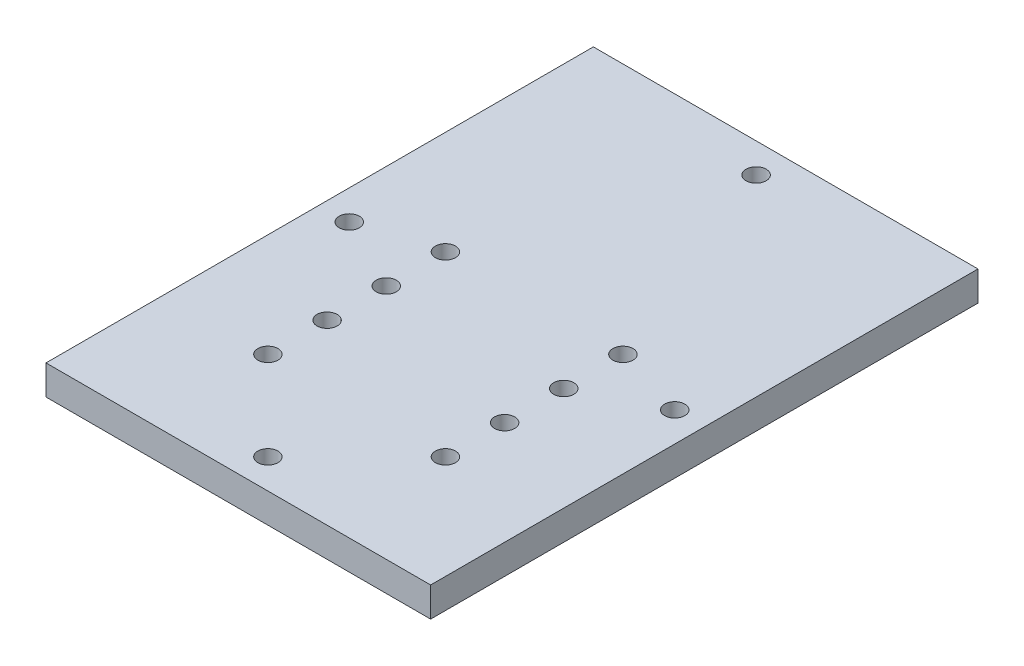
ISO-10303-21;
HEADER;
FILE_DESCRIPTION(('STEP AP214'),'2;1');
FILE_NAME('part.step','',(''),(''),'','','');
FILE_SCHEMA(('AUTOMOTIVE_DESIGN { 1 0 10303 214 1 1 1 1 }'));
ENDSEC;
DATA;
#1=APPLICATION_CONTEXT('core data for automotive mechanical design processes');
#2=APPLICATION_PROTOCOL_DEFINITION('international standard','automotive_design',2000,#1);
#3=PRODUCT_CONTEXT('',#1,'mechanical');
#4=PRODUCT('Part','Part','',(#3));
#5=PRODUCT_RELATED_PRODUCT_CATEGORY('part','',(#4));
#6=PRODUCT_DEFINITION_FORMATION('','',#4);
#7=PRODUCT_DEFINITION_CONTEXT('part definition',#1,'design');
#8=PRODUCT_DEFINITION('design','',#6,#7);
#9=PRODUCT_DEFINITION_SHAPE('','',#8);
#10=(LENGTH_UNIT() NAMED_UNIT(*) SI_UNIT(.MILLI.,.METRE.));
#11=(NAMED_UNIT(*) PLANE_ANGLE_UNIT() SI_UNIT($,.RADIAN.));
#12=(NAMED_UNIT(*) SI_UNIT($,.STERADIAN.) SOLID_ANGLE_UNIT());
#13=UNCERTAINTY_MEASURE_WITH_UNIT(LENGTH_MEASURE(1.E-05),#10,'distance_accuracy_value','');
#14=(GEOMETRIC_REPRESENTATION_CONTEXT(3) GLOBAL_UNCERTAINTY_ASSIGNED_CONTEXT((#13)) GLOBAL_UNIT_ASSIGNED_CONTEXT((#10,
#11,#12)) REPRESENTATION_CONTEXT('',''));
#15=CARTESIAN_POINT('',(0.,0.,0.));
#16=DIRECTION('',(0.,0.,1.));
#17=DIRECTION('',(1.,0.,0.));
#18=AXIS2_PLACEMENT_3D('',#15,#16,#17);
#19=CARTESIAN_POINT('',(0.,25.4,0.));
#20=DIRECTION('',(0.,1.,0.));
#21=DIRECTION('',(0.,0.,1.));
#22=AXIS2_PLACEMENT_3D('',#19,#20,#21);
#23=PLANE('',#22);
#24=CARTESIAN_POINT('',(-241.3,25.4,-203.2));
#25=DIRECTION('',(0.,1.,0.));
#26=DIRECTION('',(0.,0.,1.));
#27=AXIS2_PLACEMENT_3D('',#24,#25,#26);
#28=CIRCLE('',#27,8.64870000000001);
#29=CARTESIAN_POINT('',(-241.3,25.4,-194.5513));
#30=VERTEX_POINT('',#29);
#31=EDGE_CURVE('E174',#30,#30,#28,.T.);
#32=ORIENTED_EDGE('',*,*,#31,.F.);
#33=EDGE_LOOP('',(#32));
#34=FACE_BOUND('',#33,.T.);
#35=CARTESIAN_POINT('',(-241.3,25.4,-101.6));
#36=DIRECTION('',(0.,1.,0.));
#37=DIRECTION('',(0.,0.,1.));
#38=AXIS2_PLACEMENT_3D('',#35,#36,#37);
#39=CIRCLE('',#38,8.64870000000001);
#40=CARTESIAN_POINT('',(-241.3,25.4,-92.9513));
#41=VERTEX_POINT('',#40);
#42=EDGE_CURVE('E162',#41,#41,#39,.T.);
#43=ORIENTED_EDGE('',*,*,#42,.F.);
#44=EDGE_LOOP('',(#43));
#45=FACE_BOUND('',#44,.T.);
#46=CARTESIAN_POINT('',(-88.9,25.4,-203.2));
#47=DIRECTION('',(0.,1.,0.));
#48=DIRECTION('',(0.,0.,1.));
#49=AXIS2_PLACEMENT_3D('',#46,#47,#48);
#50=CIRCLE('',#49,8.64869999999993);
#51=CARTESIAN_POINT('',(-88.9,25.4,-194.5513));
#52=VERTEX_POINT('',#51);
#53=EDGE_CURVE('E150',#52,#52,#50,.T.);
#54=ORIENTED_EDGE('',*,*,#53,.F.);
#55=EDGE_LOOP('',(#54));
#56=FACE_BOUND('',#55,.T.);
#57=CARTESIAN_POINT('',(-88.9,25.4,-101.6));
#58=DIRECTION('',(0.,1.,0.));
#59=DIRECTION('',(0.,0.,1.));
#60=AXIS2_PLACEMENT_3D('',#57,#58,#59);
#61=CIRCLE('',#60,8.64869999999999);
#62=CARTESIAN_POINT('',(-88.9,25.4,-92.9513));
#63=VERTEX_POINT('',#62);
#64=EDGE_CURVE('E138',#63,#63,#61,.T.);
#65=ORIENTED_EDGE('',*,*,#64,.F.);
#66=EDGE_LOOP('',(#65));
#67=FACE_BOUND('',#66,.T.);
#68=CARTESIAN_POINT('',(-165.1,25.4,-25.4));
#69=DIRECTION('',(0.,1.,0.));
#70=DIRECTION('',(0.,0.,1.));
#71=AXIS2_PLACEMENT_3D('',#68,#69,#70);
#72=CIRCLE('',#71,8.64870000000001);
#73=CARTESIAN_POINT('',(-165.1,25.4,-16.7513));
#74=VERTEX_POINT('',#73);
#75=EDGE_CURVE('E126',#74,#74,#72,.T.);
#76=ORIENTED_EDGE('',*,*,#75,.F.);
#77=EDGE_LOOP('',(#76));
#78=FACE_BOUND('',#77,.T.);
#79=CARTESIAN_POINT('',(-165.1,25.4,-444.5));
#80=DIRECTION('',(0.,1.,0.));
#81=DIRECTION('',(0.,0.,1.));
#82=AXIS2_PLACEMENT_3D('',#79,#80,#81);
#83=CIRCLE('',#82,8.6487);
#84=CARTESIAN_POINT('',(-165.1,25.4,-435.8513));
#85=VERTEX_POINT('',#84);
#86=EDGE_CURVE('E105',#85,#85,#83,.T.);
#87=ORIENTED_EDGE('',*,*,#86,.F.);
#88=EDGE_LOOP('',(#87));
#89=FACE_BOUND('',#88,.T.);
#90=DIRECTION('',(0.,0.,-1.));
#91=VECTOR('',#90,1.);
#92=CARTESIAN_POINT('',(0.,25.4,0.));
#93=LINE('',#92,#91);
#94=CARTESIAN_POINT('',(0.,25.4,0.));
#95=VERTEX_POINT('',#94);
#96=CARTESIAN_POINT('',(0.,25.4,-469.9));
#97=VERTEX_POINT('',#96);
#98=EDGE_CURVE('E90',#95,#97,#93,.T.);
#99=ORIENTED_EDGE('',*,*,#98,.T.);
#100=DIRECTION('',(-1.,0.,0.));
#101=VECTOR('',#100,1.);
#102=CARTESIAN_POINT('',(0.,25.4,-469.9));
#103=LINE('',#102,#101);
#104=CARTESIAN_POINT('',(-330.2,25.4,-469.9));
#105=VERTEX_POINT('',#104);
#106=EDGE_CURVE('E85',#97,#105,#103,.T.);
#107=ORIENTED_EDGE('',*,*,#106,.T.);
#108=DIRECTION('',(0.,0.,1.));
#109=VECTOR('',#108,1.);
#110=CARTESIAN_POINT('',(-330.2,25.4,0.));
#111=LINE('',#110,#109);
#112=CARTESIAN_POINT('',(-330.2,25.4,0.));
#113=VERTEX_POINT('',#112);
#114=EDGE_CURVE('E88',#105,#113,#111,.T.);
#115=ORIENTED_EDGE('',*,*,#114,.T.);
#116=DIRECTION('',(1.,0.,0.));
#117=VECTOR('',#116,1.);
#118=CARTESIAN_POINT('',(0.,25.4,0.));
#119=LINE('',#118,#117);
#120=EDGE_CURVE('E55',#113,#95,#119,.T.);
#121=ORIENTED_EDGE('',*,*,#120,.T.);
#122=EDGE_LOOP('',(#99,#107,#115,#121));
#123=FACE_BOUND('',#122,.T.);
#124=CARTESIAN_POINT('',(-25.4,25.4,-234.95));
#125=DIRECTION('',(0.,1.,0.));
#126=DIRECTION('',(0.,0.,1.));
#127=AXIS2_PLACEMENT_3D('',#124,#125,#126);
#128=CIRCLE('',#127,8.6487);
#129=CARTESIAN_POINT('',(-25.4,25.4,-226.3013));
#130=VERTEX_POINT('',#129);
#131=EDGE_CURVE('E120',#130,#130,#128,.T.);
#132=ORIENTED_EDGE('',*,*,#131,.F.);
#133=EDGE_LOOP('',(#132));
#134=FACE_BOUND('',#133,.T.);
#135=CARTESIAN_POINT('',(-304.8,25.4,-234.95));
#136=DIRECTION('',(0.,1.,0.));
#137=DIRECTION('',(0.,0.,1.));
#138=AXIS2_PLACEMENT_3D('',#135,#136,#137);
#139=CIRCLE('',#138,8.64870000000001);
#140=CARTESIAN_POINT('',(-304.8,25.4,-226.3013));
#141=VERTEX_POINT('',#140);
#142=EDGE_CURVE('E132',#141,#141,#139,.T.);
#143=ORIENTED_EDGE('',*,*,#142,.F.);
#144=EDGE_LOOP('',(#143));
#145=FACE_BOUND('',#144,.T.);
#146=CARTESIAN_POINT('',(-88.9,25.4,-152.4));
#147=DIRECTION('',(0.,1.,0.));
#148=DIRECTION('',(0.,0.,1.));
#149=AXIS2_PLACEMENT_3D('',#146,#147,#148);
#150=CIRCLE('',#149,8.64869999999999);
#151=CARTESIAN_POINT('',(-88.9,25.4,-143.7513));
#152=VERTEX_POINT('',#151);
#153=EDGE_CURVE('E144',#152,#152,#150,.T.);
#154=ORIENTED_EDGE('',*,*,#153,.F.);
#155=EDGE_LOOP('',(#154));
#156=FACE_BOUND('',#155,.T.);
#157=CARTESIAN_POINT('',(-88.9,25.4,-254.));
#158=DIRECTION('',(0.,1.,0.));
#159=DIRECTION('',(0.,0.,1.));
#160=AXIS2_PLACEMENT_3D('',#157,#158,#159);
#161=CIRCLE('',#160,8.64869999999982);
#162=CARTESIAN_POINT('',(-88.9,25.4,-245.3513));
#163=VERTEX_POINT('',#162);
#164=EDGE_CURVE('E156',#163,#163,#161,.T.);
#165=ORIENTED_EDGE('',*,*,#164,.F.);
#166=EDGE_LOOP('',(#165));
#167=FACE_BOUND('',#166,.T.);
#168=CARTESIAN_POINT('',(-241.3,25.4,-152.4));
#169=DIRECTION('',(0.,1.,0.));
#170=DIRECTION('',(0.,0.,1.));
#171=AXIS2_PLACEMENT_3D('',#168,#169,#170);
#172=CIRCLE('',#171,8.64870000000001);
#173=CARTESIAN_POINT('',(-241.3,25.4,-143.7513));
#174=VERTEX_POINT('',#173);
#175=EDGE_CURVE('E168',#174,#174,#172,.T.);
#176=ORIENTED_EDGE('',*,*,#175,.F.);
#177=EDGE_LOOP('',(#176));
#178=FACE_BOUND('',#177,.T.);
#179=CARTESIAN_POINT('',(-241.3,25.4,-254.));
#180=DIRECTION('',(0.,1.,0.));
#181=DIRECTION('',(0.,0.,1.));
#182=AXIS2_PLACEMENT_3D('',#179,#180,#181);
#183=CIRCLE('',#182,8.6487);
#184=CARTESIAN_POINT('',(-241.3,25.4,-245.3513));
#185=VERTEX_POINT('',#184);
#186=EDGE_CURVE('E180',#185,#185,#183,.T.);
#187=ORIENTED_EDGE('',*,*,#186,.F.);
#188=EDGE_LOOP('',(#187));
#189=FACE_BOUND('',#188,.T.);
#190=ADVANCED_FACE('F38',(#34,#45,#56,#67,#78,#89,#123,#134,#145,#156,#167,#178,#189),#23,.T.);
#191=CARTESIAN_POINT('',(0.,0.,0.));
#192=DIRECTION('',(0.,1.,0.));
#193=DIRECTION('',(0.,0.,1.));
#194=AXIS2_PLACEMENT_3D('',#191,#192,#193);
#195=PLANE('',#194);
#196=DIRECTION('',(0.,0.,-1.));
#197=VECTOR('',#196,1.);
#198=CARTESIAN_POINT('',(0.,0.,0.));
#199=LINE('',#198,#197);
#200=CARTESIAN_POINT('',(0.,0.,0.));
#201=VERTEX_POINT('',#200);
#202=CARTESIAN_POINT('',(0.,0.,-469.9));
#203=VERTEX_POINT('',#202);
#204=EDGE_CURVE('E102',#201,#203,#199,.T.);
#205=ORIENTED_EDGE('',*,*,#204,.F.);
#206=DIRECTION('',(1.,0.,0.));
#207=VECTOR('',#206,1.);
#208=CARTESIAN_POINT('',(0.,0.,0.));
#209=LINE('',#208,#207);
#210=CARTESIAN_POINT('',(-330.2,0.,0.));
#211=VERTEX_POINT('',#210);
#212=EDGE_CURVE('E78',#211,#201,#209,.T.);
#213=ORIENTED_EDGE('',*,*,#212,.F.);
#214=DIRECTION('',(0.,0.,1.));
#215=VECTOR('',#214,1.);
#216=CARTESIAN_POINT('',(-330.2,0.,0.));
#217=LINE('',#216,#215);
#218=CARTESIAN_POINT('',(-330.2,0.,-469.9));
#219=VERTEX_POINT('',#218);
#220=EDGE_CURVE('E72',#219,#211,#217,.T.);
#221=ORIENTED_EDGE('',*,*,#220,.F.);
#222=DIRECTION('',(-1.,0.,0.));
#223=VECTOR('',#222,1.);
#224=CARTESIAN_POINT('',(0.,0.,-469.9));
#225=LINE('',#224,#223);
#226=EDGE_CURVE('E94',#203,#219,#225,.T.);
#227=ORIENTED_EDGE('',*,*,#226,.F.);
#228=EDGE_LOOP('',(#205,#213,#221,#227));
#229=FACE_BOUND('',#228,.T.);
#230=CARTESIAN_POINT('',(-165.1,0.,-444.5));
#231=DIRECTION('',(0.,1.,0.));
#232=DIRECTION('',(0.,0.,1.));
#233=AXIS2_PLACEMENT_3D('',#230,#231,#232);
#234=CIRCLE('',#233,8.6487);
#235=CARTESIAN_POINT('',(-165.1,0.,-435.8513));
#236=VERTEX_POINT('',#235);
#237=EDGE_CURVE('E117',#236,#236,#234,.T.);
#238=ORIENTED_EDGE('',*,*,#237,.T.);
#239=EDGE_LOOP('',(#238));
#240=FACE_BOUND('',#239,.T.);
#241=CARTESIAN_POINT('',(-25.4,0.,-234.95));
#242=DIRECTION('',(0.,1.,0.));
#243=DIRECTION('',(0.,0.,1.));
#244=AXIS2_PLACEMENT_3D('',#241,#242,#243);
#245=CIRCLE('',#244,8.6487);
#246=CARTESIAN_POINT('',(-25.4,0.,-226.3013));
#247=VERTEX_POINT('',#246);
#248=EDGE_CURVE('E123',#247,#247,#245,.T.);
#249=ORIENTED_EDGE('',*,*,#248,.T.);
#250=EDGE_LOOP('',(#249));
#251=FACE_BOUND('',#250,.T.);
#252=CARTESIAN_POINT('',(-165.1,0.,-25.4));
#253=DIRECTION('',(0.,1.,0.));
#254=DIRECTION('',(0.,0.,1.));
#255=AXIS2_PLACEMENT_3D('',#252,#253,#254);
#256=CIRCLE('',#255,8.64870000000001);
#257=CARTESIAN_POINT('',(-165.1,0.,-16.7513));
#258=VERTEX_POINT('',#257);
#259=EDGE_CURVE('E129',#258,#258,#256,.T.);
#260=ORIENTED_EDGE('',*,*,#259,.T.);
#261=EDGE_LOOP('',(#260));
#262=FACE_BOUND('',#261,.T.);
#263=CARTESIAN_POINT('',(-304.8,0.,-234.95));
#264=DIRECTION('',(0.,1.,0.));
#265=DIRECTION('',(0.,0.,1.));
#266=AXIS2_PLACEMENT_3D('',#263,#264,#265);
#267=CIRCLE('',#266,8.64870000000001);
#268=CARTESIAN_POINT('',(-304.8,0.,-226.3013));
#269=VERTEX_POINT('',#268);
#270=EDGE_CURVE('E135',#269,#269,#267,.T.);
#271=ORIENTED_EDGE('',*,*,#270,.T.);
#272=EDGE_LOOP('',(#271));
#273=FACE_BOUND('',#272,.T.);
#274=CARTESIAN_POINT('',(-88.9,0.,-101.6));
#275=DIRECTION('',(0.,1.,0.));
#276=DIRECTION('',(0.,0.,1.));
#277=AXIS2_PLACEMENT_3D('',#274,#275,#276);
#278=CIRCLE('',#277,8.64869999999999);
#279=CARTESIAN_POINT('',(-88.9,0.,-92.9513));
#280=VERTEX_POINT('',#279);
#281=EDGE_CURVE('E141',#280,#280,#278,.T.);
#282=ORIENTED_EDGE('',*,*,#281,.T.);
#283=EDGE_LOOP('',(#282));
#284=FACE_BOUND('',#283,.T.);
#285=CARTESIAN_POINT('',(-88.9,0.,-152.4));
#286=DIRECTION('',(0.,1.,0.));
#287=DIRECTION('',(0.,0.,1.));
#288=AXIS2_PLACEMENT_3D('',#285,#286,#287);
#289=CIRCLE('',#288,8.64869999999999);
#290=CARTESIAN_POINT('',(-88.9,0.,-143.7513));
#291=VERTEX_POINT('',#290);
#292=EDGE_CURVE('E147',#291,#291,#289,.T.);
#293=ORIENTED_EDGE('',*,*,#292,.T.);
#294=EDGE_LOOP('',(#293));
#295=FACE_BOUND('',#294,.T.);
#296=CARTESIAN_POINT('',(-88.9,0.,-203.2));
#297=DIRECTION('',(0.,1.,0.));
#298=DIRECTION('',(0.,0.,1.));
#299=AXIS2_PLACEMENT_3D('',#296,#297,#298);
#300=CIRCLE('',#299,8.64869999999993);
#301=CARTESIAN_POINT('',(-88.9,0.,-194.5513));
#302=VERTEX_POINT('',#301);
#303=EDGE_CURVE('E153',#302,#302,#300,.T.);
#304=ORIENTED_EDGE('',*,*,#303,.T.);
#305=EDGE_LOOP('',(#304));
#306=FACE_BOUND('',#305,.T.);
#307=CARTESIAN_POINT('',(-88.9,0.,-254.));
#308=DIRECTION('',(0.,1.,0.));
#309=DIRECTION('',(0.,0.,1.));
#310=AXIS2_PLACEMENT_3D('',#307,#308,#309);
#311=CIRCLE('',#310,8.64869999999982);
#312=CARTESIAN_POINT('',(-88.9,0.,-245.3513));
#313=VERTEX_POINT('',#312);
#314=EDGE_CURVE('E159',#313,#313,#311,.T.);
#315=ORIENTED_EDGE('',*,*,#314,.T.);
#316=EDGE_LOOP('',(#315));
#317=FACE_BOUND('',#316,.T.);
#318=CARTESIAN_POINT('',(-241.3,0.,-101.6));
#319=DIRECTION('',(0.,1.,0.));
#320=DIRECTION('',(0.,0.,1.));
#321=AXIS2_PLACEMENT_3D('',#318,#319,#320);
#322=CIRCLE('',#321,8.64870000000001);
#323=CARTESIAN_POINT('',(-241.3,0.,-92.9513));
#324=VERTEX_POINT('',#323);
#325=EDGE_CURVE('E165',#324,#324,#322,.T.);
#326=ORIENTED_EDGE('',*,*,#325,.T.);
#327=EDGE_LOOP('',(#326));
#328=FACE_BOUND('',#327,.T.);
#329=CARTESIAN_POINT('',(-241.3,0.,-152.4));
#330=DIRECTION('',(0.,1.,0.));
#331=DIRECTION('',(0.,0.,1.));
#332=AXIS2_PLACEMENT_3D('',#329,#330,#331);
#333=CIRCLE('',#332,8.64870000000001);
#334=CARTESIAN_POINT('',(-241.3,0.,-143.7513));
#335=VERTEX_POINT('',#334);
#336=EDGE_CURVE('E171',#335,#335,#333,.T.);
#337=ORIENTED_EDGE('',*,*,#336,.T.);
#338=EDGE_LOOP('',(#337));
#339=FACE_BOUND('',#338,.T.);
#340=CARTESIAN_POINT('',(-241.3,0.,-203.2));
#341=DIRECTION('',(0.,1.,0.));
#342=DIRECTION('',(0.,0.,1.));
#343=AXIS2_PLACEMENT_3D('',#340,#341,#342);
#344=CIRCLE('',#343,8.64870000000001);
#345=CARTESIAN_POINT('',(-241.3,0.,-194.5513));
#346=VERTEX_POINT('',#345);
#347=EDGE_CURVE('E177',#346,#346,#344,.T.);
#348=ORIENTED_EDGE('',*,*,#347,.T.);
#349=EDGE_LOOP('',(#348));
#350=FACE_BOUND('',#349,.T.);
#351=CARTESIAN_POINT('',(-241.3,0.,-254.));
#352=DIRECTION('',(0.,1.,0.));
#353=DIRECTION('',(0.,0.,1.));
#354=AXIS2_PLACEMENT_3D('',#351,#352,#353);
#355=CIRCLE('',#354,8.6487);
#356=CARTESIAN_POINT('',(-241.3,0.,-245.3513));
#357=VERTEX_POINT('',#356);
#358=EDGE_CURVE('E183',#357,#357,#355,.T.);
#359=ORIENTED_EDGE('',*,*,#358,.T.);
#360=EDGE_LOOP('',(#359));
#361=FACE_BOUND('',#360,.T.);
#362=ADVANCED_FACE('F113',(#229,#240,#251,#262,#273,#284,#295,#306,#317,#328,#339,#350,#361),
#195,.F.);
#363=CARTESIAN_POINT('',(0.,25.4,0.));
#364=DIRECTION('',(-1.,0.,0.));
#365=DIRECTION('',(0.,0.,1.));
#366=AXIS2_PLACEMENT_3D('',#363,#364,#365);
#367=PLANE('',#366);
#368=ORIENTED_EDGE('',*,*,#204,.T.);
#369=DIRECTION('',(0.,-1.,0.));
#370=VECTOR('',#369,1.);
#371=CARTESIAN_POINT('',(0.,25.4,-469.9));
#372=LINE('',#371,#370);
#373=EDGE_CURVE('E11',#97,#203,#372,.T.);
#374=ORIENTED_EDGE('',*,*,#373,.F.);
#375=ORIENTED_EDGE('',*,*,#98,.F.);
#376=DIRECTION('',(0.,-1.,0.));
#377=VECTOR('',#376,1.);
#378=CARTESIAN_POINT('',(0.,25.4,0.));
#379=LINE('',#378,#377);
#380=EDGE_CURVE('E98',#95,#201,#379,.T.);
#381=ORIENTED_EDGE('',*,*,#380,.T.);
#382=EDGE_LOOP('',(#368,#374,#375,#381));
#383=FACE_BOUND('',#382,.T.);
#384=ADVANCED_FACE('F40',(#383),#367,.F.);
#385=CARTESIAN_POINT('',(0.,25.4,-469.9));
#386=DIRECTION('',(0.,0.,1.));
#387=DIRECTION('',(1.,0.,0.));
#388=AXIS2_PLACEMENT_3D('',#385,#386,#387);
#389=PLANE('',#388);
#390=ORIENTED_EDGE('',*,*,#226,.T.);
#391=DIRECTION('',(0.,-1.,0.));
#392=VECTOR('',#391,1.);
#393=CARTESIAN_POINT('',(-330.2,25.4,-469.9));
#394=LINE('',#393,#392);
#395=EDGE_CURVE('E47',#105,#219,#394,.T.);
#396=ORIENTED_EDGE('',*,*,#395,.F.);
#397=ORIENTED_EDGE('',*,*,#106,.F.);
#398=ORIENTED_EDGE('',*,*,#373,.T.);
#399=EDGE_LOOP('',(#390,#396,#397,#398));
#400=FACE_BOUND('',#399,.T.);
#401=ADVANCED_FACE('F93',(#400),#389,.F.);
#402=CARTESIAN_POINT('',(-330.2,25.4,0.));
#403=DIRECTION('',(1.,0.,0.));
#404=DIRECTION('',(0.,0.,-1.));
#405=AXIS2_PLACEMENT_3D('',#402,#403,#404);
#406=PLANE('',#405);
#407=ORIENTED_EDGE('',*,*,#220,.T.);
#408=DIRECTION('',(0.,-1.,0.));
#409=VECTOR('',#408,1.);
#410=CARTESIAN_POINT('',(-330.2,25.4,0.));
#411=LINE('',#410,#409);
#412=EDGE_CURVE('E95',#113,#211,#411,.T.);
#413=ORIENTED_EDGE('',*,*,#412,.F.);
#414=ORIENTED_EDGE('',*,*,#114,.F.);
#415=ORIENTED_EDGE('',*,*,#395,.T.);
#416=EDGE_LOOP('',(#407,#413,#414,#415));
#417=FACE_BOUND('',#416,.T.);
#418=ADVANCED_FACE('F96',(#417),#406,.F.);
#419=CARTESIAN_POINT('',(0.,25.4,0.));
#420=DIRECTION('',(0.,0.,-1.));
#421=DIRECTION('',(-1.,0.,0.));
#422=AXIS2_PLACEMENT_3D('',#419,#420,#421);
#423=PLANE('',#422);
#424=ORIENTED_EDGE('',*,*,#212,.T.);
#425=ORIENTED_EDGE('',*,*,#380,.F.);
#426=ORIENTED_EDGE('',*,*,#120,.F.);
#427=ORIENTED_EDGE('',*,*,#412,.T.);
#428=EDGE_LOOP('',(#424,#425,#426,#427));
#429=FACE_BOUND('',#428,.T.);
#430=ADVANCED_FACE('F110',(#429),#423,.F.);
#431=CARTESIAN_POINT('',(-165.1,25.4,-444.5));
#432=DIRECTION('',(0.,-1.,0.));
#433=DIRECTION('',(0.,0.,-1.));
#434=AXIS2_PLACEMENT_3D('',#431,#432,#433);
#435=CYLINDRICAL_SURFACE('',#434,8.6487);
#436=ORIENTED_EDGE('',*,*,#86,.T.);
#437=EDGE_LOOP('',(#436));
#438=FACE_BOUND('',#437,.T.);
#439=ORIENTED_EDGE('',*,*,#237,.F.);
#440=EDGE_LOOP('',(#439));
#441=FACE_BOUND('',#440,.T.);
#442=ADVANCED_FACE('F202',(#438,#441),#435,.F.);
#443=CARTESIAN_POINT('',(-25.4,25.4,-234.95));
#444=DIRECTION('',(0.,-1.,0.));
#445=DIRECTION('',(0.,0.,-1.));
#446=AXIS2_PLACEMENT_3D('',#443,#444,#445);
#447=CYLINDRICAL_SURFACE('',#446,8.6487);
#448=ORIENTED_EDGE('',*,*,#131,.T.);
#449=EDGE_LOOP('',(#448));
#450=FACE_BOUND('',#449,.T.);
#451=ORIENTED_EDGE('',*,*,#248,.F.);
#452=EDGE_LOOP('',(#451));
#453=FACE_BOUND('',#452,.T.);
#454=ADVANCED_FACE('F250',(#450,#453),#447,.F.);
#455=CARTESIAN_POINT('',(-165.1,25.4,-25.4));
#456=DIRECTION('',(0.,-1.,0.));
#457=DIRECTION('',(0.,0.,-1.));
#458=AXIS2_PLACEMENT_3D('',#455,#456,#457);
#459=CYLINDRICAL_SURFACE('',#458,8.64870000000001);
#460=ORIENTED_EDGE('',*,*,#75,.T.);
#461=EDGE_LOOP('',(#460));
#462=FACE_BOUND('',#461,.T.);
#463=ORIENTED_EDGE('',*,*,#259,.F.);
#464=EDGE_LOOP('',(#463));
#465=FACE_BOUND('',#464,.T.);
#466=ADVANCED_FACE('F258',(#462,#465),#459,.F.);
#467=CARTESIAN_POINT('',(-304.8,25.4,-234.95));
#468=DIRECTION('',(0.,-1.,0.));
#469=DIRECTION('',(0.,0.,-1.));
#470=AXIS2_PLACEMENT_3D('',#467,#468,#469);
#471=CYLINDRICAL_SURFACE('',#470,8.64870000000001);
#472=ORIENTED_EDGE('',*,*,#142,.T.);
#473=EDGE_LOOP('',(#472));
#474=FACE_BOUND('',#473,.T.);
#475=ORIENTED_EDGE('',*,*,#270,.F.);
#476=EDGE_LOOP('',(#475));
#477=FACE_BOUND('',#476,.T.);
#478=ADVANCED_FACE('F266',(#474,#477),#471,.F.);
#479=CARTESIAN_POINT('',(-88.9,25.4,-101.6));
#480=DIRECTION('',(0.,-1.,0.));
#481=DIRECTION('',(0.,0.,-1.));
#482=AXIS2_PLACEMENT_3D('',#479,#480,#481);
#483=CYLINDRICAL_SURFACE('',#482,8.64869999999999);
#484=ORIENTED_EDGE('',*,*,#64,.T.);
#485=EDGE_LOOP('',(#484));
#486=FACE_BOUND('',#485,.T.);
#487=ORIENTED_EDGE('',*,*,#281,.F.);
#488=EDGE_LOOP('',(#487));
#489=FACE_BOUND('',#488,.T.);
#490=ADVANCED_FACE('F275',(#486,#489),#483,.F.);
#491=CARTESIAN_POINT('',(-88.9,25.4,-152.4));
#492=DIRECTION('',(0.,-1.,0.));
#493=DIRECTION('',(0.,0.,-1.));
#494=AXIS2_PLACEMENT_3D('',#491,#492,#493);
#495=CYLINDRICAL_SURFACE('',#494,8.64869999999999);
#496=ORIENTED_EDGE('',*,*,#153,.T.);
#497=EDGE_LOOP('',(#496));
#498=FACE_BOUND('',#497,.T.);
#499=ORIENTED_EDGE('',*,*,#292,.F.);
#500=EDGE_LOOP('',(#499));
#501=FACE_BOUND('',#500,.T.);
#502=ADVANCED_FACE('F284',(#498,#501),#495,.F.);
#503=CARTESIAN_POINT('',(-88.9,25.4,-203.2));
#504=DIRECTION('',(0.,-1.,0.));
#505=DIRECTION('',(0.,0.,-1.));
#506=AXIS2_PLACEMENT_3D('',#503,#504,#505);
#507=CYLINDRICAL_SURFACE('',#506,8.64869999999993);
#508=ORIENTED_EDGE('',*,*,#53,.T.);
#509=EDGE_LOOP('',(#508));
#510=FACE_BOUND('',#509,.T.);
#511=ORIENTED_EDGE('',*,*,#303,.F.);
#512=EDGE_LOOP('',(#511));
#513=FACE_BOUND('',#512,.T.);
#514=ADVANCED_FACE('F293',(#510,#513),#507,.F.);
#515=CARTESIAN_POINT('',(-88.9,25.4,-254.));
#516=DIRECTION('',(0.,-1.,0.));
#517=DIRECTION('',(0.,0.,-1.));
#518=AXIS2_PLACEMENT_3D('',#515,#516,#517);
#519=CYLINDRICAL_SURFACE('',#518,8.64869999999982);
#520=ORIENTED_EDGE('',*,*,#164,.T.);
#521=EDGE_LOOP('',(#520));
#522=FACE_BOUND('',#521,.T.);
#523=ORIENTED_EDGE('',*,*,#314,.F.);
#524=EDGE_LOOP('',(#523));
#525=FACE_BOUND('',#524,.T.);
#526=ADVANCED_FACE('F302',(#522,#525),#519,.F.);
#527=CARTESIAN_POINT('',(-241.3,25.4,-101.6));
#528=DIRECTION('',(0.,-1.,0.));
#529=DIRECTION('',(0.,0.,-1.));
#530=AXIS2_PLACEMENT_3D('',#527,#528,#529);
#531=CYLINDRICAL_SURFACE('',#530,8.64870000000001);
#532=ORIENTED_EDGE('',*,*,#42,.T.);
#533=EDGE_LOOP('',(#532));
#534=FACE_BOUND('',#533,.T.);
#535=ORIENTED_EDGE('',*,*,#325,.F.);
#536=EDGE_LOOP('',(#535));
#537=FACE_BOUND('',#536,.T.);
#538=ADVANCED_FACE('F311',(#534,#537),#531,.F.);
#539=CARTESIAN_POINT('',(-241.3,25.4,-152.4));
#540=DIRECTION('',(0.,-1.,0.));
#541=DIRECTION('',(0.,0.,-1.));
#542=AXIS2_PLACEMENT_3D('',#539,#540,#541);
#543=CYLINDRICAL_SURFACE('',#542,8.64870000000001);
#544=ORIENTED_EDGE('',*,*,#175,.T.);
#545=EDGE_LOOP('',(#544));
#546=FACE_BOUND('',#545,.T.);
#547=ORIENTED_EDGE('',*,*,#336,.F.);
#548=EDGE_LOOP('',(#547));
#549=FACE_BOUND('',#548,.T.);
#550=ADVANCED_FACE('F320',(#546,#549),#543,.F.);
#551=CARTESIAN_POINT('',(-241.3,25.4,-203.2));
#552=DIRECTION('',(0.,-1.,0.));
#553=DIRECTION('',(0.,0.,-1.));
#554=AXIS2_PLACEMENT_3D('',#551,#552,#553);
#555=CYLINDRICAL_SURFACE('',#554,8.64870000000001);
#556=ORIENTED_EDGE('',*,*,#31,.T.);
#557=EDGE_LOOP('',(#556));
#558=FACE_BOUND('',#557,.T.);
#559=ORIENTED_EDGE('',*,*,#347,.F.);
#560=EDGE_LOOP('',(#559));
#561=FACE_BOUND('',#560,.T.);
#562=ADVANCED_FACE('F329',(#558,#561),#555,.F.);
#563=CARTESIAN_POINT('',(-241.3,25.4,-254.));
#564=DIRECTION('',(0.,-1.,0.));
#565=DIRECTION('',(0.,0.,-1.));
#566=AXIS2_PLACEMENT_3D('',#563,#564,#565);
#567=CYLINDRICAL_SURFACE('',#566,8.6487);
#568=ORIENTED_EDGE('',*,*,#186,.T.);
#569=EDGE_LOOP('',(#568));
#570=FACE_BOUND('',#569,.T.);
#571=ORIENTED_EDGE('',*,*,#358,.F.);
#572=EDGE_LOOP('',(#571));
#573=FACE_BOUND('',#572,.T.);
#574=ADVANCED_FACE('F189',(#570,#573),#567,.F.);
#575=CLOSED_SHELL('',(#190,#362,#384,#401,#418,#430,#442,#454,#466,#478,#490,#502,#514,#526,
#538,#550,#562,#574));
#576=MANIFOLD_SOLID_BREP('B2',#575);
#577=ADVANCED_BREP_SHAPE_REPRESENTATION('',(#18,#576),#14);
#578=SHAPE_DEFINITION_REPRESENTATION(#9,#577);
ENDSEC;
END-ISO-10303-21;
